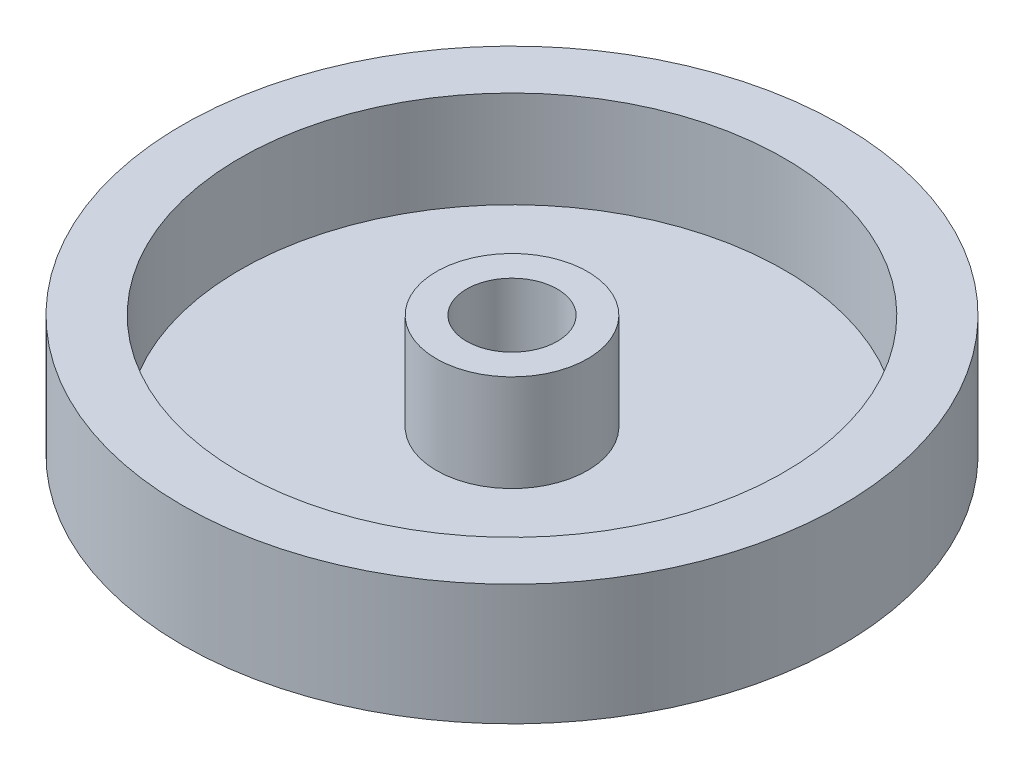
ISO-10303-21;
HEADER;
FILE_DESCRIPTION(('STEP AP214'),'2;1');
FILE_NAME('part.step','',(''),(''),'','','');
FILE_SCHEMA(('AUTOMOTIVE_DESIGN { 1 0 10303 214 1 1 1 1 }'));
ENDSEC;
DATA;
#1=APPLICATION_CONTEXT('core data for automotive mechanical design processes');
#2=APPLICATION_PROTOCOL_DEFINITION('international standard','automotive_design',2000,#1);
#3=PRODUCT_CONTEXT('',#1,'mechanical');
#4=PRODUCT('Part','Part','',(#3));
#5=PRODUCT_RELATED_PRODUCT_CATEGORY('part','',(#4));
#6=PRODUCT_DEFINITION_FORMATION('','',#4);
#7=PRODUCT_DEFINITION_CONTEXT('part definition',#1,'design');
#8=PRODUCT_DEFINITION('design','',#6,#7);
#9=PRODUCT_DEFINITION_SHAPE('','',#8);
#10=(LENGTH_UNIT() NAMED_UNIT(*) SI_UNIT(.MILLI.,.METRE.));
#11=(NAMED_UNIT(*) PLANE_ANGLE_UNIT() SI_UNIT($,.RADIAN.));
#12=(NAMED_UNIT(*) SI_UNIT($,.STERADIAN.) SOLID_ANGLE_UNIT());
#13=UNCERTAINTY_MEASURE_WITH_UNIT(LENGTH_MEASURE(1.E-05),#10,'distance_accuracy_value','');
#14=(GEOMETRIC_REPRESENTATION_CONTEXT(3) GLOBAL_UNCERTAINTY_ASSIGNED_CONTEXT((#13)) GLOBAL_UNIT_ASSIGNED_CONTEXT((#10,
#11,#12)) REPRESENTATION_CONTEXT('',''));
#15=CARTESIAN_POINT('',(0.,0.,0.));
#16=DIRECTION('',(0.,0.,1.));
#17=DIRECTION('',(1.,0.,0.));
#18=AXIS2_PLACEMENT_3D('',#15,#16,#17);
#19=CARTESIAN_POINT('',(0.,4.,0.));
#20=DIRECTION('',(0.,-1.,0.));
#21=DIRECTION('',(0.,0.,-1.));
#22=AXIS2_PLACEMENT_3D('',#19,#20,#21);
#23=CYLINDRICAL_SURFACE('',#22,10.9);
#24=CARTESIAN_POINT('',(0.,4.,0.));
#25=DIRECTION('',(0.,1.,0.));
#26=DIRECTION('',(0.,0.,1.));
#27=AXIS2_PLACEMENT_3D('',#24,#25,#26);
#28=CIRCLE('',#27,10.9);
#29=CARTESIAN_POINT('',(0.,4.,10.9));
#30=VERTEX_POINT('',#29);
#31=EDGE_CURVE('E10',#30,#30,#28,.T.);
#32=ORIENTED_EDGE('',*,*,#31,.F.);
#33=EDGE_LOOP('',(#32));
#34=FACE_BOUND('',#33,.T.);
#35=CARTESIAN_POINT('',(0.,0.,0.));
#36=DIRECTION('',(0.,1.,0.));
#37=DIRECTION('',(0.,0.,1.));
#38=AXIS2_PLACEMENT_3D('',#35,#36,#37);
#39=CIRCLE('',#38,10.9);
#40=CARTESIAN_POINT('',(0.,0.,10.9));
#41=VERTEX_POINT('',#40);
#42=EDGE_CURVE('E32',#41,#41,#39,.T.);
#43=ORIENTED_EDGE('',*,*,#42,.T.);
#44=EDGE_LOOP('',(#43));
#45=FACE_BOUND('',#44,.T.);
#46=ADVANCED_FACE('F29',(#34,#45),#23,.T.);
#47=CARTESIAN_POINT('',(0.,4.,0.));
#48=DIRECTION('',(0.,1.,0.));
#49=DIRECTION('',(0.,0.,1.));
#50=AXIS2_PLACEMENT_3D('',#47,#48,#49);
#51=PLANE('',#50);
#52=CARTESIAN_POINT('',(0.,4.,0.));
#53=DIRECTION('',(0.,1.,0.));
#54=DIRECTION('',(0.,0.,1.));
#55=AXIS2_PLACEMENT_3D('',#52,#53,#54);
#56=CIRCLE('',#55,9.);
#57=CARTESIAN_POINT('',(0.,4.,9.));
#58=VERTEX_POINT('',#57);
#59=EDGE_CURVE('E41',#58,#58,#56,.T.);
#60=ORIENTED_EDGE('',*,*,#59,.F.);
#61=EDGE_LOOP('',(#60));
#62=FACE_BOUND('',#61,.T.);
#63=ORIENTED_EDGE('',*,*,#31,.T.);
#64=EDGE_LOOP('',(#63));
#65=FACE_BOUND('',#64,.T.);
#66=ADVANCED_FACE('F73',(#62,#65),#51,.T.);
#67=CARTESIAN_POINT('',(0.,0.,0.));
#68=DIRECTION('',(0.,1.,0.));
#69=DIRECTION('',(0.,0.,1.));
#70=AXIS2_PLACEMENT_3D('',#67,#68,#69);
#71=PLANE('',#70);
#72=CARTESIAN_POINT('',(0.,0.,0.));
#73=DIRECTION('',(0.,1.,0.));
#74=DIRECTION('',(0.,0.,1.));
#75=AXIS2_PLACEMENT_3D('',#72,#73,#74);
#76=CIRCLE('',#75,1.5);
#77=CARTESIAN_POINT('',(0.,0.,1.5));
#78=VERTEX_POINT('',#77);
#79=EDGE_CURVE('E50',#78,#78,#76,.T.);
#80=ORIENTED_EDGE('',*,*,#79,.T.);
#81=EDGE_LOOP('',(#80));
#82=FACE_BOUND('',#81,.T.);
#83=ORIENTED_EDGE('',*,*,#42,.F.);
#84=EDGE_LOOP('',(#83));
#85=FACE_BOUND('',#84,.T.);
#86=ADVANCED_FACE('F59',(#82,#85),#71,.F.);
#87=CARTESIAN_POINT('',(0.,0.8,0.));
#88=DIRECTION('',(0.,1.,0.));
#89=DIRECTION('',(0.,0.,1.));
#90=AXIS2_PLACEMENT_3D('',#87,#88,#89);
#91=CYLINDRICAL_SURFACE('',#90,9.);
#92=CARTESIAN_POINT('',(0.,0.8,0.));
#93=DIRECTION('',(0.,1.,0.));
#94=DIRECTION('',(0.,0.,1.));
#95=AXIS2_PLACEMENT_3D('',#92,#93,#94);
#96=CIRCLE('',#95,9.);
#97=CARTESIAN_POINT('',(0.,0.8,9.));
#98=VERTEX_POINT('',#97);
#99=EDGE_CURVE('E39',#98,#98,#96,.T.);
#100=ORIENTED_EDGE('',*,*,#99,.F.);
#101=EDGE_LOOP('',(#100));
#102=FACE_BOUND('',#101,.T.);
#103=ORIENTED_EDGE('',*,*,#59,.T.);
#104=EDGE_LOOP('',(#103));
#105=FACE_BOUND('',#104,.T.);
#106=ADVANCED_FACE('F83',(#102,#105),#91,.F.);
#107=CARTESIAN_POINT('',(0.,0.8,0.));
#108=DIRECTION('',(0.,1.,0.));
#109=DIRECTION('',(0.,0.,1.));
#110=AXIS2_PLACEMENT_3D('',#107,#108,#109);
#111=PLANE('',#110);
#112=CARTESIAN_POINT('',(0.,0.8,0.));
#113=DIRECTION('',(0.,1.,0.));
#114=DIRECTION('',(0.,0.,1.));
#115=AXIS2_PLACEMENT_3D('',#112,#113,#114);
#116=CIRCLE('',#115,2.5);
#117=CARTESIAN_POINT('',(0.,0.8,2.5));
#118=VERTEX_POINT('',#117);
#119=EDGE_CURVE('E44',#118,#118,#116,.T.);
#120=ORIENTED_EDGE('',*,*,#119,.F.);
#121=EDGE_LOOP('',(#120));
#122=FACE_BOUND('',#121,.T.);
#123=ORIENTED_EDGE('',*,*,#99,.T.);
#124=EDGE_LOOP('',(#123));
#125=FACE_BOUND('',#124,.T.);
#126=ADVANCED_FACE('F77',(#122,#125),#111,.T.);
#127=CARTESIAN_POINT('',(0.,0.8,0.));
#128=DIRECTION('',(0.,1.,0.));
#129=DIRECTION('',(0.,0.,1.));
#130=AXIS2_PLACEMENT_3D('',#127,#128,#129);
#131=CYLINDRICAL_SURFACE('',#130,2.5);
#132=ORIENTED_EDGE('',*,*,#119,.T.);
#133=EDGE_LOOP('',(#132));
#134=FACE_BOUND('',#133,.T.);
#135=CARTESIAN_POINT('',(0.,4.,0.));
#136=DIRECTION('',(0.,1.,0.));
#137=DIRECTION('',(0.,0.,1.));
#138=AXIS2_PLACEMENT_3D('',#135,#136,#137);
#139=CIRCLE('',#138,2.5);
#140=CARTESIAN_POINT('',(0.,4.,2.5));
#141=VERTEX_POINT('',#140);
#142=EDGE_CURVE('E47',#141,#141,#139,.T.);
#143=ORIENTED_EDGE('',*,*,#142,.F.);
#144=EDGE_LOOP('',(#143));
#145=FACE_BOUND('',#144,.T.);
#146=ADVANCED_FACE('F71',(#134,#145),#131,.T.);
#147=CARTESIAN_POINT('',(0.,4.,0.));
#148=DIRECTION('',(0.,1.,0.));
#149=DIRECTION('',(0.,0.,1.));
#150=AXIS2_PLACEMENT_3D('',#147,#148,#149);
#151=CIRCLE('',#150,1.5);
#152=CARTESIAN_POINT('',(0.,4.,1.5));
#153=VERTEX_POINT('',#152);
#154=EDGE_CURVE('E53',#153,#153,#151,.T.);
#155=ORIENTED_EDGE('',*,*,#154,.F.);
#156=EDGE_LOOP('',(#155));
#157=FACE_BOUND('',#156,.T.);
#158=ORIENTED_EDGE('',*,*,#142,.T.);
#159=EDGE_LOOP('',(#158));
#160=FACE_BOUND('',#159,.T.);
#161=ADVANCED_FACE('F65',(#157,#160),#51,.T.);
#162=CARTESIAN_POINT('',(0.,0.,0.));
#163=DIRECTION('',(0.,1.,0.));
#164=DIRECTION('',(0.,0.,1.));
#165=AXIS2_PLACEMENT_3D('',#162,#163,#164);
#166=CYLINDRICAL_SURFACE('',#165,1.5);
#167=ORIENTED_EDGE('',*,*,#79,.F.);
#168=EDGE_LOOP('',(#167));
#169=FACE_BOUND('',#168,.T.);
#170=ORIENTED_EDGE('',*,*,#154,.T.);
#171=EDGE_LOOP('',(#170));
#172=FACE_BOUND('',#171,.T.);
#173=ADVANCED_FACE('F62',(#169,#172),#166,.F.);
#174=CLOSED_SHELL('',(#46,#66,#86,#106,#126,#146,#161,#173));
#175=MANIFOLD_SOLID_BREP('B2',#174);
#176=ADVANCED_BREP_SHAPE_REPRESENTATION('',(#18,#175),#14);
#177=SHAPE_DEFINITION_REPRESENTATION(#9,#176);
ENDSEC;
END-ISO-10303-21;
